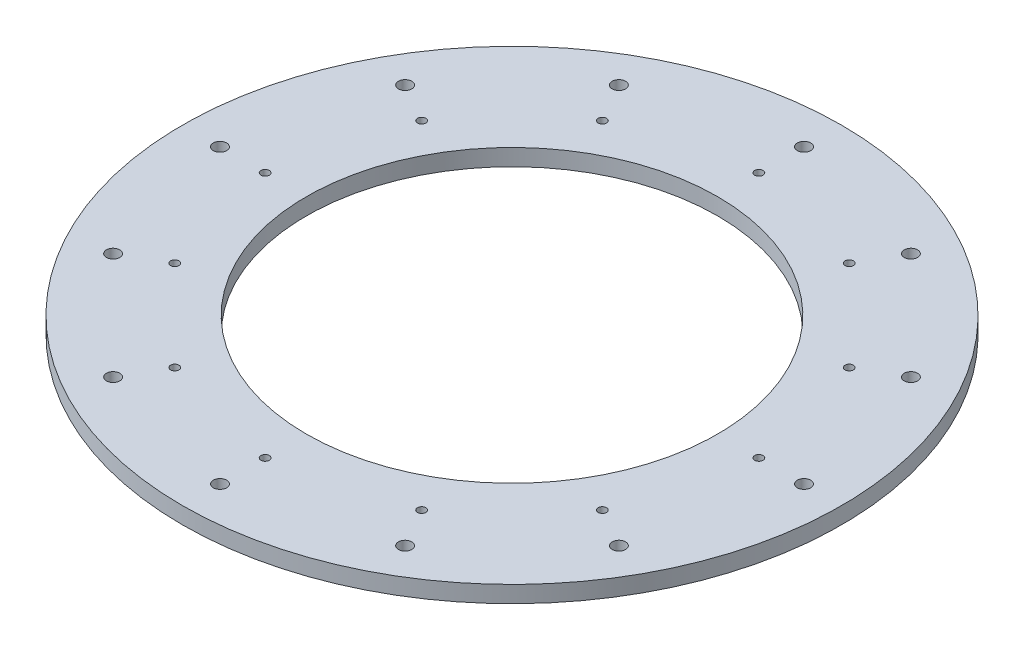
ISO-10303-21;
HEADER;
FILE_DESCRIPTION(('STEP AP214'),'2;1');
FILE_NAME('part.step','',(''),(''),'','','');
FILE_SCHEMA(('AUTOMOTIVE_DESIGN { 1 0 10303 214 1 1 1 1 }'));
ENDSEC;
DATA;
#1=APPLICATION_CONTEXT('core data for automotive mechanical design processes');
#2=APPLICATION_PROTOCOL_DEFINITION('international standard','automotive_design',2000,#1);
#3=PRODUCT_CONTEXT('',#1,'mechanical');
#4=PRODUCT('Part','Part','',(#3));
#5=PRODUCT_RELATED_PRODUCT_CATEGORY('part','',(#4));
#6=PRODUCT_DEFINITION_FORMATION('','',#4);
#7=PRODUCT_DEFINITION_CONTEXT('part definition',#1,'design');
#8=PRODUCT_DEFINITION('design','',#6,#7);
#9=PRODUCT_DEFINITION_SHAPE('','',#8);
#10=(LENGTH_UNIT() NAMED_UNIT(*) SI_UNIT(.MILLI.,.METRE.));
#11=(NAMED_UNIT(*) PLANE_ANGLE_UNIT() SI_UNIT($,.RADIAN.));
#12=(NAMED_UNIT(*) SI_UNIT($,.STERADIAN.) SOLID_ANGLE_UNIT());
#13=UNCERTAINTY_MEASURE_WITH_UNIT(LENGTH_MEASURE(1.E-05),#10,'distance_accuracy_value','');
#14=(GEOMETRIC_REPRESENTATION_CONTEXT(3) GLOBAL_UNCERTAINTY_ASSIGNED_CONTEXT((#13)) GLOBAL_UNIT_ASSIGNED_CONTEXT((#10,
#11,#12)) REPRESENTATION_CONTEXT('',''));
#15=CARTESIAN_POINT('',(0.,0.,0.));
#16=DIRECTION('',(0.,0.,1.));
#17=DIRECTION('',(1.,0.,0.));
#18=AXIS2_PLACEMENT_3D('',#15,#16,#17);
#19=CARTESIAN_POINT('',(0.,4.,0.));
#20=DIRECTION('',(0.,1.,0.));
#21=DIRECTION('',(0.,0.,1.));
#22=AXIS2_PLACEMENT_3D('',#19,#20,#21);
#23=PLANE('',#22);
#24=CARTESIAN_POINT('',(-60.6217782649134,4.,-34.9999999999953));
#25=DIRECTION('',(0.,1.,0.));
#26=DIRECTION('',(0.,0.,1.));
#27=AXIS2_PLACEMENT_3D('',#24,#25,#26);
#28=CIRCLE('',#27,1.6);
#29=CARTESIAN_POINT('',(-60.6217782649134,4.,-33.3999999999953));
#30=VERTEX_POINT('',#29);
#31=EDGE_CURVE('E179',#30,#30,#28,.T.);
#32=ORIENTED_EDGE('',*,*,#31,.F.);
#33=EDGE_LOOP('',(#32));
#34=FACE_BOUND('',#33,.T.);
#35=CARTESIAN_POINT('',(-60.621778264908,4.,35.0000000000047));
#36=DIRECTION('',(0.,1.,0.));
#37=DIRECTION('',(0.,0.,1.));
#38=AXIS2_PLACEMENT_3D('',#35,#36,#37);
#39=CIRCLE('',#38,1.6);
#40=CARTESIAN_POINT('',(-60.621778264908,4.,36.6000000000047));
#41=VERTEX_POINT('',#40);
#42=EDGE_CURVE('E167',#41,#41,#39,.T.);
#43=ORIENTED_EDGE('',*,*,#42,.F.);
#44=EDGE_LOOP('',(#43));
#45=FACE_BOUND('',#44,.T.);
#46=CARTESIAN_POINT('',(5.33826321493611E-12,4.,70.));
#47=DIRECTION('',(0.,1.,0.));
#48=DIRECTION('',(0.,0.,1.));
#49=AXIS2_PLACEMENT_3D('',#46,#47,#48);
#50=CIRCLE('',#49,1.6);
#51=CARTESIAN_POINT('',(5.33826321493611E-12,4.,71.6));
#52=VERTEX_POINT('',#51);
#53=EDGE_CURVE('E155',#52,#52,#50,.T.);
#54=ORIENTED_EDGE('',*,*,#53,.F.);
#55=EDGE_LOOP('',(#54));
#56=FACE_BOUND('',#55,.T.);
#57=CARTESIAN_POINT('',(60.6217782649134,4.,34.9999999999954));
#58=DIRECTION('',(0.,1.,0.));
#59=DIRECTION('',(0.,0.,1.));
#60=AXIS2_PLACEMENT_3D('',#57,#58,#59);
#61=CIRCLE('',#60,1.6);
#62=CARTESIAN_POINT('',(60.6217782649134,4.,36.5999999999954));
#63=VERTEX_POINT('',#62);
#64=EDGE_CURVE('E143',#63,#63,#61,.T.);
#65=ORIENTED_EDGE('',*,*,#64,.F.);
#66=EDGE_LOOP('',(#65));
#67=FACE_BOUND('',#66,.T.);
#68=CARTESIAN_POINT('',(60.621778264908,4.,-35.0000000000046));
#69=DIRECTION('',(0.,1.,0.));
#70=DIRECTION('',(0.,0.,1.));
#71=AXIS2_PLACEMENT_3D('',#68,#69,#70);
#72=CIRCLE('',#71,1.6);
#73=CARTESIAN_POINT('',(60.621778264908,4.,-33.4000000000046));
#74=VERTEX_POINT('',#73);
#75=EDGE_CURVE('E131',#74,#74,#72,.T.);
#76=ORIENTED_EDGE('',*,*,#75,.F.);
#77=EDGE_LOOP('',(#76));
#78=FACE_BOUND('',#77,.T.);
#79=CARTESIAN_POINT('',(-5.33825504828902E-12,4.,-70.));
#80=DIRECTION('',(0.,1.,0.));
#81=DIRECTION('',(0.,0.,1.));
#82=AXIS2_PLACEMENT_3D('',#79,#80,#81);
#83=CIRCLE('',#82,1.6);
#84=CARTESIAN_POINT('',(-5.33825504828902E-12,4.,-68.4));
#85=VERTEX_POINT('',#84);
#86=EDGE_CURVE('E119',#85,#85,#83,.T.);
#87=ORIENTED_EDGE('',*,*,#86,.F.);
#88=EDGE_LOOP('',(#87));
#89=FACE_BOUND('',#88,.T.);
#90=CARTESIAN_POINT('',(-51.2513833959644,4.,-29.5899999999978));
#91=DIRECTION('',(0.,1.,0.));
#92=DIRECTION('',(0.,0.,1.));
#93=AXIS2_PLACEMENT_3D('',#90,#91,#92);
#94=CIRCLE('',#93,0.999999999999998);
#95=CARTESIAN_POINT('',(-51.2513833959644,4.,-28.5899999999978));
#96=VERTEX_POINT('',#95);
#97=EDGE_CURVE('E107',#96,#96,#94,.T.);
#98=ORIENTED_EDGE('',*,*,#97,.F.);
#99=EDGE_LOOP('',(#98));
#100=FACE_BOUND('',#99,.T.);
#101=CARTESIAN_POINT('',(-51.2513833959618,4.,29.5900000000022));
#102=DIRECTION('',(0.,1.,0.));
#103=DIRECTION('',(0.,0.,1.));
#104=AXIS2_PLACEMENT_3D('',#101,#102,#103);
#105=CIRCLE('',#104,0.999999999999998);
#106=CARTESIAN_POINT('',(-51.2513833959618,4.,30.5900000000022));
#107=VERTEX_POINT('',#106);
#108=EDGE_CURVE('E95',#107,#107,#105,.T.);
#109=ORIENTED_EDGE('',*,*,#108,.F.);
#110=EDGE_LOOP('',(#109));
#111=FACE_BOUND('',#110,.T.);
#112=CARTESIAN_POINT('',(2.5155533984381E-12,4.,59.18));
#113=DIRECTION('',(0.,1.,0.));
#114=DIRECTION('',(0.,0.,1.));
#115=AXIS2_PLACEMENT_3D('',#112,#113,#114);
#116=CIRCLE('',#115,1.);
#117=CARTESIAN_POINT('',(2.5155533984381E-12,4.,60.18));
#118=VERTEX_POINT('',#117);
#119=EDGE_CURVE('E83',#118,#118,#116,.T.);
#120=ORIENTED_EDGE('',*,*,#119,.F.);
#121=EDGE_LOOP('',(#120));
#122=FACE_BOUND('',#121,.T.);
#123=CARTESIAN_POINT('',(51.2513833959644,4.,29.5899999999978));
#124=DIRECTION('',(0.,1.,0.));
#125=DIRECTION('',(0.,0.,1.));
#126=AXIS2_PLACEMENT_3D('',#123,#124,#125);
#127=CIRCLE('',#126,0.999999999999998);
#128=CARTESIAN_POINT('',(51.2513833959644,4.,30.5899999999978));
#129=VERTEX_POINT('',#128);
#130=EDGE_CURVE('E71',#129,#129,#127,.T.);
#131=ORIENTED_EDGE('',*,*,#130,.F.);
#132=EDGE_LOOP('',(#131));
#133=FACE_BOUND('',#132,.T.);
#134=CARTESIAN_POINT('',(51.2513833959618,4.,-29.5900000000022));
#135=DIRECTION('',(0.,1.,0.));
#136=DIRECTION('',(0.,0.,1.));
#137=AXIS2_PLACEMENT_3D('',#134,#135,#136);
#138=CIRCLE('',#137,0.999999999999998);
#139=CARTESIAN_POINT('',(51.2513833959618,4.,-28.5900000000022));
#140=VERTEX_POINT('',#139);
#141=EDGE_CURVE('E59',#140,#140,#138,.T.);
#142=ORIENTED_EDGE('',*,*,#141,.F.);
#143=EDGE_LOOP('',(#142));
#144=FACE_BOUND('',#143,.T.);
#145=CARTESIAN_POINT('',(0.,4.,0.));
#146=DIRECTION('',(0.,1.,0.));
#147=DIRECTION('',(0.,0.,1.));
#148=AXIS2_PLACEMENT_3D('',#145,#146,#147);
#149=CIRCLE('',#148,49.3);
#150=CARTESIAN_POINT('',(0.,4.,49.3));
#151=VERTEX_POINT('',#150);
#152=EDGE_CURVE('E47',#151,#151,#149,.T.);
#153=ORIENTED_EDGE('',*,*,#152,.F.);
#154=EDGE_LOOP('',(#153));
#155=FACE_BOUND('',#154,.T.);
#156=CARTESIAN_POINT('',(0.,4.,0.));
#157=DIRECTION('',(0.,1.,0.));
#158=DIRECTION('',(0.,0.,1.));
#159=AXIS2_PLACEMENT_3D('',#156,#157,#158);
#160=CIRCLE('',#159,79.);
#161=CARTESIAN_POINT('',(0.,4.,79.));
#162=VERTEX_POINT('',#161);
#163=EDGE_CURVE('E10',#162,#162,#160,.T.);
#164=ORIENTED_EDGE('',*,*,#163,.T.);
#165=EDGE_LOOP('',(#164));
#166=FACE_BOUND('',#165,.T.);
#167=CARTESIAN_POINT('',(-2.51601204363263E-12,4.,-59.18));
#168=DIRECTION('',(0.,1.,0.));
#169=DIRECTION('',(0.,0.,1.));
#170=AXIS2_PLACEMENT_3D('',#167,#168,#169);
#171=CIRCLE('',#170,1.);
#172=CARTESIAN_POINT('',(-2.51601204363263E-12,4.,-58.18));
#173=VERTEX_POINT('',#172);
#174=EDGE_CURVE('E42',#173,#173,#171,.T.);
#175=ORIENTED_EDGE('',*,*,#174,.F.);
#176=EDGE_LOOP('',(#175));
#177=FACE_BOUND('',#176,.T.);
#178=CARTESIAN_POINT('',(29.5899999999978,4.,-51.2513833959643));
#179=DIRECTION('',(0.,1.,0.));
#180=DIRECTION('',(0.,0.,1.));
#181=AXIS2_PLACEMENT_3D('',#178,#179,#180);
#182=CIRCLE('',#181,1.);
#183=CARTESIAN_POINT('',(29.5899999999978,4.,-50.2513833959643));
#184=VERTEX_POINT('',#183);
#185=EDGE_CURVE('E53',#184,#184,#182,.T.);
#186=ORIENTED_EDGE('',*,*,#185,.F.);
#187=EDGE_LOOP('',(#186));
#188=FACE_BOUND('',#187,.T.);
#189=CARTESIAN_POINT('',(59.18,4.,-2.51881848711832E-12));
#190=DIRECTION('',(0.,1.,0.));
#191=DIRECTION('',(0.,0.,1.));
#192=AXIS2_PLACEMENT_3D('',#189,#190,#191);
#193=CIRCLE('',#192,0.999999999999998);
#194=CARTESIAN_POINT('',(59.18,4.,0.999999999997479));
#195=VERTEX_POINT('',#194);
#196=EDGE_CURVE('E65',#195,#195,#193,.T.);
#197=ORIENTED_EDGE('',*,*,#196,.F.);
#198=EDGE_LOOP('',(#197));
#199=FACE_BOUND('',#198,.T.);
#200=CARTESIAN_POINT('',(29.5900000000022,4.,51.2513833959618));
#201=DIRECTION('',(0.,1.,0.));
#202=DIRECTION('',(0.,0.,1.));
#203=AXIS2_PLACEMENT_3D('',#200,#201,#202);
#204=CIRCLE('',#203,1.);
#205=CARTESIAN_POINT('',(29.5900000000022,4.,52.2513833959618));
#206=VERTEX_POINT('',#205);
#207=EDGE_CURVE('E77',#206,#206,#204,.T.);
#208=ORIENTED_EDGE('',*,*,#207,.F.);
#209=EDGE_LOOP('',(#208));
#210=FACE_BOUND('',#209,.T.);
#211=CARTESIAN_POINT('',(-29.5899999999978,4.,51.2513833959644));
#212=DIRECTION('',(0.,1.,0.));
#213=DIRECTION('',(0.,0.,1.));
#214=AXIS2_PLACEMENT_3D('',#211,#212,#213);
#215=CIRCLE('',#214,1.);
#216=CARTESIAN_POINT('',(-29.5899999999978,4.,52.2513833959644));
#217=VERTEX_POINT('',#216);
#218=EDGE_CURVE('E89',#217,#217,#215,.T.);
#219=ORIENTED_EDGE('',*,*,#218,.F.);
#220=EDGE_LOOP('',(#219));
#221=FACE_BOUND('',#220,.T.);
#222=CARTESIAN_POINT('',(-59.18,4.,2.52575738102223E-12));
#223=DIRECTION('',(0.,1.,0.));
#224=DIRECTION('',(0.,0.,1.));
#225=AXIS2_PLACEMENT_3D('',#222,#223,#224);
#226=CIRCLE('',#225,0.999999999999998);
#227=CARTESIAN_POINT('',(-59.18,4.,1.00000000000252));
#228=VERTEX_POINT('',#227);
#229=EDGE_CURVE('E101',#228,#228,#226,.T.);
#230=ORIENTED_EDGE('',*,*,#229,.F.);
#231=EDGE_LOOP('',(#230));
#232=FACE_BOUND('',#231,.T.);
#233=CARTESIAN_POINT('',(-29.5900000000022,4.,-51.2513833959618));
#234=DIRECTION('',(0.,1.,0.));
#235=DIRECTION('',(0.,0.,1.));
#236=AXIS2_PLACEMENT_3D('',#233,#234,#235);
#237=CIRCLE('',#236,1.);
#238=CARTESIAN_POINT('',(-29.5900000000022,4.,-50.2513833959618));
#239=VERTEX_POINT('',#238);
#240=EDGE_CURVE('E113',#239,#239,#237,.T.);
#241=ORIENTED_EDGE('',*,*,#240,.F.);
#242=EDGE_LOOP('',(#241));
#243=FACE_BOUND('',#242,.T.);
#244=CARTESIAN_POINT('',(34.9999999999954,4.,-60.6217782649134));
#245=DIRECTION('',(0.,1.,0.));
#246=DIRECTION('',(0.,0.,1.));
#247=AXIS2_PLACEMENT_3D('',#244,#245,#246);
#248=CIRCLE('',#247,1.6);
#249=CARTESIAN_POINT('',(34.9999999999954,4.,-59.0217782649134));
#250=VERTEX_POINT('',#249);
#251=EDGE_CURVE('E125',#250,#250,#248,.T.);
#252=ORIENTED_EDGE('',*,*,#251,.F.);
#253=EDGE_LOOP('',(#252));
#254=FACE_BOUND('',#253,.T.);
#255=CARTESIAN_POINT('',(70.,4.,-5.34294830600857E-12));
#256=DIRECTION('',(0.,1.,0.));
#257=DIRECTION('',(0.,0.,1.));
#258=AXIS2_PLACEMENT_3D('',#255,#256,#257);
#259=CIRCLE('',#258,1.60000000000001);
#260=CARTESIAN_POINT('',(70.,4.,1.59999999999466));
#261=VERTEX_POINT('',#260);
#262=EDGE_CURVE('E137',#261,#261,#259,.T.);
#263=ORIENTED_EDGE('',*,*,#262,.F.);
#264=EDGE_LOOP('',(#263));
#265=FACE_BOUND('',#264,.T.);
#266=CARTESIAN_POINT('',(35.0000000000047,4.,60.621778264908));
#267=DIRECTION('',(0.,1.,0.));
#268=DIRECTION('',(0.,0.,1.));
#269=AXIS2_PLACEMENT_3D('',#266,#267,#268);
#270=CIRCLE('',#269,1.6);
#271=CARTESIAN_POINT('',(35.0000000000047,4.,62.221778264908));
#272=VERTEX_POINT('',#271);
#273=EDGE_CURVE('E149',#272,#272,#270,.T.);
#274=ORIENTED_EDGE('',*,*,#273,.F.);
#275=EDGE_LOOP('',(#274));
#276=FACE_BOUND('',#275,.T.);
#277=CARTESIAN_POINT('',(-34.9999999999954,4.,60.6217782649134));
#278=DIRECTION('',(0.,1.,0.));
#279=DIRECTION('',(0.,0.,1.));
#280=AXIS2_PLACEMENT_3D('',#277,#278,#279);
#281=CIRCLE('',#280,1.6);
#282=CARTESIAN_POINT('',(-34.9999999999954,4.,62.2217782649134));
#283=VERTEX_POINT('',#282);
#284=EDGE_CURVE('E161',#283,#283,#281,.T.);
#285=ORIENTED_EDGE('',*,*,#284,.F.);
#286=EDGE_LOOP('',(#285));
#287=FACE_BOUND('',#286,.T.);
#288=CARTESIAN_POINT('',(-70.,4.,5.35075456165046E-12));
#289=DIRECTION('',(0.,1.,0.));
#290=DIRECTION('',(0.,0.,1.));
#291=AXIS2_PLACEMENT_3D('',#288,#289,#290);
#292=CIRCLE('',#291,1.60000000000001);
#293=CARTESIAN_POINT('',(-70.,4.,1.60000000000536));
#294=VERTEX_POINT('',#293);
#295=EDGE_CURVE('E173',#294,#294,#292,.T.);
#296=ORIENTED_EDGE('',*,*,#295,.F.);
#297=EDGE_LOOP('',(#296));
#298=FACE_BOUND('',#297,.T.);
#299=CARTESIAN_POINT('',(-35.0000000000047,4.,-60.621778264908));
#300=DIRECTION('',(0.,1.,0.));
#301=DIRECTION('',(0.,0.,1.));
#302=AXIS2_PLACEMENT_3D('',#299,#300,#301);
#303=CIRCLE('',#302,1.6);
#304=CARTESIAN_POINT('',(-35.0000000000047,4.,-59.021778264908));
#305=VERTEX_POINT('',#304);
#306=EDGE_CURVE('E185',#305,#305,#303,.T.);
#307=ORIENTED_EDGE('',*,*,#306,.F.);
#308=EDGE_LOOP('',(#307));
#309=FACE_BOUND('',#308,.T.);
#310=ADVANCED_FACE('F31',(#34,#45,#56,#67,#78,#89,#100,#111,#122,#133,#144,#155,#166,#177,#188,
#199,#210,#221,#232,#243,#254,#265,#276,#287,#298,#309),#23,.T.);
#311=CARTESIAN_POINT('',(0.,0.,0.));
#312=DIRECTION('',(0.,1.,0.));
#313=DIRECTION('',(0.,0.,1.));
#314=AXIS2_PLACEMENT_3D('',#311,#312,#313);
#315=PLANE('',#314);
#316=CARTESIAN_POINT('',(0.,0.,0.));
#317=DIRECTION('',(0.,1.,0.));
#318=DIRECTION('',(0.,0.,1.));
#319=AXIS2_PLACEMENT_3D('',#316,#317,#318);
#320=CIRCLE('',#319,79.);
#321=CARTESIAN_POINT('',(0.,0.,79.));
#322=VERTEX_POINT('',#321);
#323=EDGE_CURVE('E35',#322,#322,#320,.T.);
#324=ORIENTED_EDGE('',*,*,#323,.F.);
#325=EDGE_LOOP('',(#324));
#326=FACE_BOUND('',#325,.T.);
#327=CARTESIAN_POINT('',(-2.51601204363263E-12,0.,-59.18));
#328=DIRECTION('',(0.,1.,0.));
#329=DIRECTION('',(0.,0.,1.));
#330=AXIS2_PLACEMENT_3D('',#327,#328,#329);
#331=CIRCLE('',#330,1.);
#332=CARTESIAN_POINT('',(-2.51601204363263E-12,0.,-58.18));
#333=VERTEX_POINT('',#332);
#334=EDGE_CURVE('E44',#333,#333,#331,.T.);
#335=ORIENTED_EDGE('',*,*,#334,.T.);
#336=EDGE_LOOP('',(#335));
#337=FACE_BOUND('',#336,.T.);
#338=CARTESIAN_POINT('',(0.,0.,0.));
#339=DIRECTION('',(0.,1.,0.));
#340=DIRECTION('',(0.,0.,1.));
#341=AXIS2_PLACEMENT_3D('',#338,#339,#340);
#342=CIRCLE('',#341,49.3);
#343=CARTESIAN_POINT('',(0.,0.,49.3));
#344=VERTEX_POINT('',#343);
#345=EDGE_CURVE('E50',#344,#344,#342,.T.);
#346=ORIENTED_EDGE('',*,*,#345,.T.);
#347=EDGE_LOOP('',(#346));
#348=FACE_BOUND('',#347,.T.);
#349=CARTESIAN_POINT('',(29.5899999999978,0.,-51.2513833959643));
#350=DIRECTION('',(0.,1.,0.));
#351=DIRECTION('',(0.,0.,1.));
#352=AXIS2_PLACEMENT_3D('',#349,#350,#351);
#353=CIRCLE('',#352,1.);
#354=CARTESIAN_POINT('',(29.5899999999978,0.,-50.2513833959643));
#355=VERTEX_POINT('',#354);
#356=EDGE_CURVE('E56',#355,#355,#353,.T.);
#357=ORIENTED_EDGE('',*,*,#356,.T.);
#358=EDGE_LOOP('',(#357));
#359=FACE_BOUND('',#358,.T.);
#360=CARTESIAN_POINT('',(51.2513833959618,0.,-29.5900000000022));
#361=DIRECTION('',(0.,1.,0.));
#362=DIRECTION('',(0.,0.,1.));
#363=AXIS2_PLACEMENT_3D('',#360,#361,#362);
#364=CIRCLE('',#363,0.999999999999998);
#365=CARTESIAN_POINT('',(51.2513833959618,0.,-28.5900000000022));
#366=VERTEX_POINT('',#365);
#367=EDGE_CURVE('E62',#366,#366,#364,.T.);
#368=ORIENTED_EDGE('',*,*,#367,.T.);
#369=EDGE_LOOP('',(#368));
#370=FACE_BOUND('',#369,.T.);
#371=CARTESIAN_POINT('',(59.18,0.,-2.51881848711832E-12));
#372=DIRECTION('',(0.,1.,0.));
#373=DIRECTION('',(0.,0.,1.));
#374=AXIS2_PLACEMENT_3D('',#371,#372,#373);
#375=CIRCLE('',#374,0.999999999999998);
#376=CARTESIAN_POINT('',(59.18,0.,0.999999999997479));
#377=VERTEX_POINT('',#376);
#378=EDGE_CURVE('E68',#377,#377,#375,.T.);
#379=ORIENTED_EDGE('',*,*,#378,.T.);
#380=EDGE_LOOP('',(#379));
#381=FACE_BOUND('',#380,.T.);
#382=CARTESIAN_POINT('',(51.2513833959644,0.,29.5899999999978));
#383=DIRECTION('',(0.,1.,0.));
#384=DIRECTION('',(0.,0.,1.));
#385=AXIS2_PLACEMENT_3D('',#382,#383,#384);
#386=CIRCLE('',#385,0.999999999999998);
#387=CARTESIAN_POINT('',(51.2513833959644,0.,30.5899999999978));
#388=VERTEX_POINT('',#387);
#389=EDGE_CURVE('E74',#388,#388,#386,.T.);
#390=ORIENTED_EDGE('',*,*,#389,.T.);
#391=EDGE_LOOP('',(#390));
#392=FACE_BOUND('',#391,.T.);
#393=CARTESIAN_POINT('',(29.5900000000022,0.,51.2513833959618));
#394=DIRECTION('',(0.,1.,0.));
#395=DIRECTION('',(0.,0.,1.));
#396=AXIS2_PLACEMENT_3D('',#393,#394,#395);
#397=CIRCLE('',#396,1.);
#398=CARTESIAN_POINT('',(29.5900000000022,0.,52.2513833959618));
#399=VERTEX_POINT('',#398);
#400=EDGE_CURVE('E80',#399,#399,#397,.T.);
#401=ORIENTED_EDGE('',*,*,#400,.T.);
#402=EDGE_LOOP('',(#401));
#403=FACE_BOUND('',#402,.T.);
#404=CARTESIAN_POINT('',(2.5155533984381E-12,0.,59.18));
#405=DIRECTION('',(0.,1.,0.));
#406=DIRECTION('',(0.,0.,1.));
#407=AXIS2_PLACEMENT_3D('',#404,#405,#406);
#408=CIRCLE('',#407,1.);
#409=CARTESIAN_POINT('',(2.5155533984381E-12,0.,60.18));
#410=VERTEX_POINT('',#409);
#411=EDGE_CURVE('E86',#410,#410,#408,.T.);
#412=ORIENTED_EDGE('',*,*,#411,.T.);
#413=EDGE_LOOP('',(#412));
#414=FACE_BOUND('',#413,.T.);
#415=CARTESIAN_POINT('',(-29.5899999999978,0.,51.2513833959644));
#416=DIRECTION('',(0.,1.,0.));
#417=DIRECTION('',(0.,0.,1.));
#418=AXIS2_PLACEMENT_3D('',#415,#416,#417);
#419=CIRCLE('',#418,1.);
#420=CARTESIAN_POINT('',(-29.5899999999978,0.,52.2513833959644));
#421=VERTEX_POINT('',#420);
#422=EDGE_CURVE('E92',#421,#421,#419,.T.);
#423=ORIENTED_EDGE('',*,*,#422,.T.);
#424=EDGE_LOOP('',(#423));
#425=FACE_BOUND('',#424,.T.);
#426=CARTESIAN_POINT('',(-51.2513833959618,0.,29.5900000000022));
#427=DIRECTION('',(0.,1.,0.));
#428=DIRECTION('',(0.,0.,1.));
#429=AXIS2_PLACEMENT_3D('',#426,#427,#428);
#430=CIRCLE('',#429,0.999999999999998);
#431=CARTESIAN_POINT('',(-51.2513833959618,0.,30.5900000000022));
#432=VERTEX_POINT('',#431);
#433=EDGE_CURVE('E98',#432,#432,#430,.T.);
#434=ORIENTED_EDGE('',*,*,#433,.T.);
#435=EDGE_LOOP('',(#434));
#436=FACE_BOUND('',#435,.T.);
#437=CARTESIAN_POINT('',(-59.18,0.,2.52575738102223E-12));
#438=DIRECTION('',(0.,1.,0.));
#439=DIRECTION('',(0.,0.,1.));
#440=AXIS2_PLACEMENT_3D('',#437,#438,#439);
#441=CIRCLE('',#440,0.999999999999998);
#442=CARTESIAN_POINT('',(-59.18,0.,1.00000000000252));
#443=VERTEX_POINT('',#442);
#444=EDGE_CURVE('E104',#443,#443,#441,.T.);
#445=ORIENTED_EDGE('',*,*,#444,.T.);
#446=EDGE_LOOP('',(#445));
#447=FACE_BOUND('',#446,.T.);
#448=CARTESIAN_POINT('',(-51.2513833959644,0.,-29.5899999999978));
#449=DIRECTION('',(0.,1.,0.));
#450=DIRECTION('',(0.,0.,1.));
#451=AXIS2_PLACEMENT_3D('',#448,#449,#450);
#452=CIRCLE('',#451,0.999999999999998);
#453=CARTESIAN_POINT('',(-51.2513833959644,0.,-28.5899999999978));
#454=VERTEX_POINT('',#453);
#455=EDGE_CURVE('E110',#454,#454,#452,.T.);
#456=ORIENTED_EDGE('',*,*,#455,.T.);
#457=EDGE_LOOP('',(#456));
#458=FACE_BOUND('',#457,.T.);
#459=CARTESIAN_POINT('',(-29.5900000000022,0.,-51.2513833959618));
#460=DIRECTION('',(0.,1.,0.));
#461=DIRECTION('',(0.,0.,1.));
#462=AXIS2_PLACEMENT_3D('',#459,#460,#461);
#463=CIRCLE('',#462,1.);
#464=CARTESIAN_POINT('',(-29.5900000000022,0.,-50.2513833959618));
#465=VERTEX_POINT('',#464);
#466=EDGE_CURVE('E116',#465,#465,#463,.T.);
#467=ORIENTED_EDGE('',*,*,#466,.T.);
#468=EDGE_LOOP('',(#467));
#469=FACE_BOUND('',#468,.T.);
#470=CARTESIAN_POINT('',(-5.33825504828902E-12,0.,-70.));
#471=DIRECTION('',(0.,1.,0.));
#472=DIRECTION('',(0.,0.,1.));
#473=AXIS2_PLACEMENT_3D('',#470,#471,#472);
#474=CIRCLE('',#473,1.6);
#475=CARTESIAN_POINT('',(-5.33825504828902E-12,0.,-68.4));
#476=VERTEX_POINT('',#475);
#477=EDGE_CURVE('E122',#476,#476,#474,.T.);
#478=ORIENTED_EDGE('',*,*,#477,.T.);
#479=EDGE_LOOP('',(#478));
#480=FACE_BOUND('',#479,.T.);
#481=CARTESIAN_POINT('',(34.9999999999954,0.,-60.6217782649134));
#482=DIRECTION('',(0.,1.,0.));
#483=DIRECTION('',(0.,0.,1.));
#484=AXIS2_PLACEMENT_3D('',#481,#482,#483);
#485=CIRCLE('',#484,1.6);
#486=CARTESIAN_POINT('',(34.9999999999954,0.,-59.0217782649134));
#487=VERTEX_POINT('',#486);
#488=EDGE_CURVE('E128',#487,#487,#485,.T.);
#489=ORIENTED_EDGE('',*,*,#488,.T.);
#490=EDGE_LOOP('',(#489));
#491=FACE_BOUND('',#490,.T.);
#492=CARTESIAN_POINT('',(60.621778264908,0.,-35.0000000000046));
#493=DIRECTION('',(0.,1.,0.));
#494=DIRECTION('',(0.,0.,1.));
#495=AXIS2_PLACEMENT_3D('',#492,#493,#494);
#496=CIRCLE('',#495,1.6);
#497=CARTESIAN_POINT('',(60.621778264908,0.,-33.4000000000046));
#498=VERTEX_POINT('',#497);
#499=EDGE_CURVE('E134',#498,#498,#496,.T.);
#500=ORIENTED_EDGE('',*,*,#499,.T.);
#501=EDGE_LOOP('',(#500));
#502=FACE_BOUND('',#501,.T.);
#503=CARTESIAN_POINT('',(70.,0.,-5.34294830600857E-12));
#504=DIRECTION('',(0.,1.,0.));
#505=DIRECTION('',(0.,0.,1.));
#506=AXIS2_PLACEMENT_3D('',#503,#504,#505);
#507=CIRCLE('',#506,1.60000000000001);
#508=CARTESIAN_POINT('',(70.,0.,1.59999999999466));
#509=VERTEX_POINT('',#508);
#510=EDGE_CURVE('E140',#509,#509,#507,.T.);
#511=ORIENTED_EDGE('',*,*,#510,.T.);
#512=EDGE_LOOP('',(#511));
#513=FACE_BOUND('',#512,.T.);
#514=CARTESIAN_POINT('',(60.6217782649134,0.,34.9999999999954));
#515=DIRECTION('',(0.,1.,0.));
#516=DIRECTION('',(0.,0.,1.));
#517=AXIS2_PLACEMENT_3D('',#514,#515,#516);
#518=CIRCLE('',#517,1.6);
#519=CARTESIAN_POINT('',(60.6217782649134,0.,36.5999999999954));
#520=VERTEX_POINT('',#519);
#521=EDGE_CURVE('E146',#520,#520,#518,.T.);
#522=ORIENTED_EDGE('',*,*,#521,.T.);
#523=EDGE_LOOP('',(#522));
#524=FACE_BOUND('',#523,.T.);
#525=CARTESIAN_POINT('',(35.0000000000047,0.,60.621778264908));
#526=DIRECTION('',(0.,1.,0.));
#527=DIRECTION('',(0.,0.,1.));
#528=AXIS2_PLACEMENT_3D('',#525,#526,#527);
#529=CIRCLE('',#528,1.6);
#530=CARTESIAN_POINT('',(35.0000000000047,0.,62.221778264908));
#531=VERTEX_POINT('',#530);
#532=EDGE_CURVE('E152',#531,#531,#529,.T.);
#533=ORIENTED_EDGE('',*,*,#532,.T.);
#534=EDGE_LOOP('',(#533));
#535=FACE_BOUND('',#534,.T.);
#536=CARTESIAN_POINT('',(5.33826321493611E-12,0.,70.));
#537=DIRECTION('',(0.,1.,0.));
#538=DIRECTION('',(0.,0.,1.));
#539=AXIS2_PLACEMENT_3D('',#536,#537,#538);
#540=CIRCLE('',#539,1.6);
#541=CARTESIAN_POINT('',(5.33826321493611E-12,0.,71.6));
#542=VERTEX_POINT('',#541);
#543=EDGE_CURVE('E158',#542,#542,#540,.T.);
#544=ORIENTED_EDGE('',*,*,#543,.T.);
#545=EDGE_LOOP('',(#544));
#546=FACE_BOUND('',#545,.T.);
#547=CARTESIAN_POINT('',(-34.9999999999954,0.,60.6217782649134));
#548=DIRECTION('',(0.,1.,0.));
#549=DIRECTION('',(0.,0.,1.));
#550=AXIS2_PLACEMENT_3D('',#547,#548,#549);
#551=CIRCLE('',#550,1.6);
#552=CARTESIAN_POINT('',(-34.9999999999954,0.,62.2217782649134));
#553=VERTEX_POINT('',#552);
#554=EDGE_CURVE('E164',#553,#553,#551,.T.);
#555=ORIENTED_EDGE('',*,*,#554,.T.);
#556=EDGE_LOOP('',(#555));
#557=FACE_BOUND('',#556,.T.);
#558=CARTESIAN_POINT('',(-60.621778264908,0.,35.0000000000047));
#559=DIRECTION('',(0.,1.,0.));
#560=DIRECTION('',(0.,0.,1.));
#561=AXIS2_PLACEMENT_3D('',#558,#559,#560);
#562=CIRCLE('',#561,1.6);
#563=CARTESIAN_POINT('',(-60.621778264908,0.,36.6000000000047));
#564=VERTEX_POINT('',#563);
#565=EDGE_CURVE('E170',#564,#564,#562,.T.);
#566=ORIENTED_EDGE('',*,*,#565,.T.);
#567=EDGE_LOOP('',(#566));
#568=FACE_BOUND('',#567,.T.);
#569=CARTESIAN_POINT('',(-70.,0.,5.35075456165046E-12));
#570=DIRECTION('',(0.,1.,0.));
#571=DIRECTION('',(0.,0.,1.));
#572=AXIS2_PLACEMENT_3D('',#569,#570,#571);
#573=CIRCLE('',#572,1.60000000000001);
#574=CARTESIAN_POINT('',(-70.,0.,1.60000000000536));
#575=VERTEX_POINT('',#574);
#576=EDGE_CURVE('E176',#575,#575,#573,.T.);
#577=ORIENTED_EDGE('',*,*,#576,.T.);
#578=EDGE_LOOP('',(#577));
#579=FACE_BOUND('',#578,.T.);
#580=CARTESIAN_POINT('',(-60.6217782649134,0.,-34.9999999999953));
#581=DIRECTION('',(0.,1.,0.));
#582=DIRECTION('',(0.,0.,1.));
#583=AXIS2_PLACEMENT_3D('',#580,#581,#582);
#584=CIRCLE('',#583,1.6);
#585=CARTESIAN_POINT('',(-60.6217782649134,0.,-33.3999999999953));
#586=VERTEX_POINT('',#585);
#587=EDGE_CURVE('E182',#586,#586,#584,.T.);
#588=ORIENTED_EDGE('',*,*,#587,.T.);
#589=EDGE_LOOP('',(#588));
#590=FACE_BOUND('',#589,.T.);
#591=CARTESIAN_POINT('',(-35.0000000000047,0.,-60.621778264908));
#592=DIRECTION('',(0.,1.,0.));
#593=DIRECTION('',(0.,0.,1.));
#594=AXIS2_PLACEMENT_3D('',#591,#592,#593);
#595=CIRCLE('',#594,1.6);
#596=CARTESIAN_POINT('',(-35.0000000000047,0.,-59.021778264908));
#597=VERTEX_POINT('',#596);
#598=EDGE_CURVE('E188',#597,#597,#595,.T.);
#599=ORIENTED_EDGE('',*,*,#598,.T.);
#600=EDGE_LOOP('',(#599));
#601=FACE_BOUND('',#600,.T.);
#602=ADVANCED_FACE('F198',(#326,#337,#348,#359,#370,#381,#392,#403,#414,#425,#436,#447,#458,
#469,#480,#491,#502,#513,#524,#535,#546,#557,#568,#579,#590,#601),#315,.F.);
#603=CARTESIAN_POINT('',(0.,4.,0.));
#604=DIRECTION('',(0.,-1.,0.));
#605=DIRECTION('',(0.,0.,-1.));
#606=AXIS2_PLACEMENT_3D('',#603,#604,#605);
#607=CYLINDRICAL_SURFACE('',#606,79.);
#608=ORIENTED_EDGE('',*,*,#163,.F.);
#609=EDGE_LOOP('',(#608));
#610=FACE_BOUND('',#609,.T.);
#611=ORIENTED_EDGE('',*,*,#323,.T.);
#612=EDGE_LOOP('',(#611));
#613=FACE_BOUND('',#612,.T.);
#614=ADVANCED_FACE('F33',(#610,#613),#607,.T.);
#615=CARTESIAN_POINT('',(-2.51601204363263E-12,4.,-59.18));
#616=DIRECTION('',(0.,-1.,0.));
#617=DIRECTION('',(0.,0.,-1.));
#618=AXIS2_PLACEMENT_3D('',#615,#616,#617);
#619=CYLINDRICAL_SURFACE('',#618,1.);
#620=ORIENTED_EDGE('',*,*,#174,.T.);
#621=EDGE_LOOP('',(#620));
#622=FACE_BOUND('',#621,.T.);
#623=ORIENTED_EDGE('',*,*,#334,.F.);
#624=EDGE_LOOP('',(#623));
#625=FACE_BOUND('',#624,.T.);
#626=ADVANCED_FACE('F208',(#622,#625),#619,.F.);
#627=CARTESIAN_POINT('',(0.,4.,0.));
#628=DIRECTION('',(0.,-1.,0.));
#629=DIRECTION('',(0.,0.,-1.));
#630=AXIS2_PLACEMENT_3D('',#627,#628,#629);
#631=CYLINDRICAL_SURFACE('',#630,49.3);
#632=ORIENTED_EDGE('',*,*,#152,.T.);
#633=EDGE_LOOP('',(#632));
#634=FACE_BOUND('',#633,.T.);
#635=ORIENTED_EDGE('',*,*,#345,.F.);
#636=EDGE_LOOP('',(#635));
#637=FACE_BOUND('',#636,.T.);
#638=ADVANCED_FACE('F211',(#634,#637),#631,.F.);
#639=CARTESIAN_POINT('',(29.5899999999978,4.,-51.2513833959643));
#640=DIRECTION('',(0.,-1.,0.));
#641=DIRECTION('',(0.,0.,-1.));
#642=AXIS2_PLACEMENT_3D('',#639,#640,#641);
#643=CYLINDRICAL_SURFACE('',#642,1.);
#644=ORIENTED_EDGE('',*,*,#185,.T.);
#645=EDGE_LOOP('',(#644));
#646=FACE_BOUND('',#645,.T.);
#647=ORIENTED_EDGE('',*,*,#356,.F.);
#648=EDGE_LOOP('',(#647));
#649=FACE_BOUND('',#648,.T.);
#650=ADVANCED_FACE('F215',(#646,#649),#643,.F.);
#651=CARTESIAN_POINT('',(51.2513833959618,4.,-29.5900000000022));
#652=DIRECTION('',(0.,-1.,0.));
#653=DIRECTION('',(0.,0.,-1.));
#654=AXIS2_PLACEMENT_3D('',#651,#652,#653);
#655=CYLINDRICAL_SURFACE('',#654,0.999999999999998);
#656=ORIENTED_EDGE('',*,*,#141,.T.);
#657=EDGE_LOOP('',(#656));
#658=FACE_BOUND('',#657,.T.);
#659=ORIENTED_EDGE('',*,*,#367,.F.);
#660=EDGE_LOOP('',(#659));
#661=FACE_BOUND('',#660,.T.);
#662=ADVANCED_FACE('F219',(#658,#661),#655,.F.);
#663=CARTESIAN_POINT('',(59.18,4.,-2.51881848711832E-12));
#664=DIRECTION('',(0.,-1.,0.));
#665=DIRECTION('',(0.,0.,-1.));
#666=AXIS2_PLACEMENT_3D('',#663,#664,#665);
#667=CYLINDRICAL_SURFACE('',#666,0.999999999999998);
#668=ORIENTED_EDGE('',*,*,#196,.T.);
#669=EDGE_LOOP('',(#668));
#670=FACE_BOUND('',#669,.T.);
#671=ORIENTED_EDGE('',*,*,#378,.F.);
#672=EDGE_LOOP('',(#671));
#673=FACE_BOUND('',#672,.T.);
#674=ADVANCED_FACE('F223',(#670,#673),#667,.F.);
#675=CARTESIAN_POINT('',(51.2513833959644,4.,29.5899999999978));
#676=DIRECTION('',(0.,-1.,0.));
#677=DIRECTION('',(0.,0.,-1.));
#678=AXIS2_PLACEMENT_3D('',#675,#676,#677);
#679=CYLINDRICAL_SURFACE('',#678,0.999999999999998);
#680=ORIENTED_EDGE('',*,*,#130,.T.);
#681=EDGE_LOOP('',(#680));
#682=FACE_BOUND('',#681,.T.);
#683=ORIENTED_EDGE('',*,*,#389,.F.);
#684=EDGE_LOOP('',(#683));
#685=FACE_BOUND('',#684,.T.);
#686=ADVANCED_FACE('F227',(#682,#685),#679,.F.);
#687=CARTESIAN_POINT('',(29.5900000000022,4.,51.2513833959618));
#688=DIRECTION('',(0.,-1.,0.));
#689=DIRECTION('',(0.,0.,-1.));
#690=AXIS2_PLACEMENT_3D('',#687,#688,#689);
#691=CYLINDRICAL_SURFACE('',#690,1.);
#692=ORIENTED_EDGE('',*,*,#207,.T.);
#693=EDGE_LOOP('',(#692));
#694=FACE_BOUND('',#693,.T.);
#695=ORIENTED_EDGE('',*,*,#400,.F.);
#696=EDGE_LOOP('',(#695));
#697=FACE_BOUND('',#696,.T.);
#698=ADVANCED_FACE('F231',(#694,#697),#691,.F.);
#699=CARTESIAN_POINT('',(2.5155533984381E-12,4.,59.18));
#700=DIRECTION('',(0.,-1.,0.));
#701=DIRECTION('',(0.,0.,-1.));
#702=AXIS2_PLACEMENT_3D('',#699,#700,#701);
#703=CYLINDRICAL_SURFACE('',#702,1.);
#704=ORIENTED_EDGE('',*,*,#119,.T.);
#705=EDGE_LOOP('',(#704));
#706=FACE_BOUND('',#705,.T.);
#707=ORIENTED_EDGE('',*,*,#411,.F.);
#708=EDGE_LOOP('',(#707));
#709=FACE_BOUND('',#708,.T.);
#710=ADVANCED_FACE('F235',(#706,#709),#703,.F.);
#711=CARTESIAN_POINT('',(-29.5899999999978,4.,51.2513833959644));
#712=DIRECTION('',(0.,-1.,0.));
#713=DIRECTION('',(0.,0.,-1.));
#714=AXIS2_PLACEMENT_3D('',#711,#712,#713);
#715=CYLINDRICAL_SURFACE('',#714,1.);
#716=ORIENTED_EDGE('',*,*,#218,.T.);
#717=EDGE_LOOP('',(#716));
#718=FACE_BOUND('',#717,.T.);
#719=ORIENTED_EDGE('',*,*,#422,.F.);
#720=EDGE_LOOP('',(#719));
#721=FACE_BOUND('',#720,.T.);
#722=ADVANCED_FACE('F239',(#718,#721),#715,.F.);
#723=CARTESIAN_POINT('',(-51.2513833959618,4.,29.5900000000022));
#724=DIRECTION('',(0.,-1.,0.));
#725=DIRECTION('',(0.,0.,-1.));
#726=AXIS2_PLACEMENT_3D('',#723,#724,#725);
#727=CYLINDRICAL_SURFACE('',#726,0.999999999999998);
#728=ORIENTED_EDGE('',*,*,#108,.T.);
#729=EDGE_LOOP('',(#728));
#730=FACE_BOUND('',#729,.T.);
#731=ORIENTED_EDGE('',*,*,#433,.F.);
#732=EDGE_LOOP('',(#731));
#733=FACE_BOUND('',#732,.T.);
#734=ADVANCED_FACE('F243',(#730,#733),#727,.F.);
#735=CARTESIAN_POINT('',(-59.18,4.,2.52575738102223E-12));
#736=DIRECTION('',(0.,-1.,0.));
#737=DIRECTION('',(0.,0.,-1.));
#738=AXIS2_PLACEMENT_3D('',#735,#736,#737);
#739=CYLINDRICAL_SURFACE('',#738,0.999999999999998);
#740=ORIENTED_EDGE('',*,*,#229,.T.);
#741=EDGE_LOOP('',(#740));
#742=FACE_BOUND('',#741,.T.);
#743=ORIENTED_EDGE('',*,*,#444,.F.);
#744=EDGE_LOOP('',(#743));
#745=FACE_BOUND('',#744,.T.);
#746=ADVANCED_FACE('F247',(#742,#745),#739,.F.);
#747=CARTESIAN_POINT('',(-51.2513833959644,4.,-29.5899999999978));
#748=DIRECTION('',(0.,-1.,0.));
#749=DIRECTION('',(0.,0.,-1.));
#750=AXIS2_PLACEMENT_3D('',#747,#748,#749);
#751=CYLINDRICAL_SURFACE('',#750,0.999999999999998);
#752=ORIENTED_EDGE('',*,*,#97,.T.);
#753=EDGE_LOOP('',(#752));
#754=FACE_BOUND('',#753,.T.);
#755=ORIENTED_EDGE('',*,*,#455,.F.);
#756=EDGE_LOOP('',(#755));
#757=FACE_BOUND('',#756,.T.);
#758=ADVANCED_FACE('F251',(#754,#757),#751,.F.);
#759=CARTESIAN_POINT('',(-29.5900000000022,4.,-51.2513833959618));
#760=DIRECTION('',(0.,-1.,0.));
#761=DIRECTION('',(0.,0.,-1.));
#762=AXIS2_PLACEMENT_3D('',#759,#760,#761);
#763=CYLINDRICAL_SURFACE('',#762,1.);
#764=ORIENTED_EDGE('',*,*,#240,.T.);
#765=EDGE_LOOP('',(#764));
#766=FACE_BOUND('',#765,.T.);
#767=ORIENTED_EDGE('',*,*,#466,.F.);
#768=EDGE_LOOP('',(#767));
#769=FACE_BOUND('',#768,.T.);
#770=ADVANCED_FACE('F255',(#766,#769),#763,.F.);
#771=CARTESIAN_POINT('',(-5.33825504828902E-12,4.,-70.));
#772=DIRECTION('',(0.,-1.,0.));
#773=DIRECTION('',(0.,0.,-1.));
#774=AXIS2_PLACEMENT_3D('',#771,#772,#773);
#775=CYLINDRICAL_SURFACE('',#774,1.6);
#776=ORIENTED_EDGE('',*,*,#86,.T.);
#777=EDGE_LOOP('',(#776));
#778=FACE_BOUND('',#777,.T.);
#779=ORIENTED_EDGE('',*,*,#477,.F.);
#780=EDGE_LOOP('',(#779));
#781=FACE_BOUND('',#780,.T.);
#782=ADVANCED_FACE('F259',(#778,#781),#775,.F.);
#783=CARTESIAN_POINT('',(34.9999999999954,4.,-60.6217782649134));
#784=DIRECTION('',(0.,-1.,0.));
#785=DIRECTION('',(0.,0.,-1.));
#786=AXIS2_PLACEMENT_3D('',#783,#784,#785);
#787=CYLINDRICAL_SURFACE('',#786,1.6);
#788=ORIENTED_EDGE('',*,*,#251,.T.);
#789=EDGE_LOOP('',(#788));
#790=FACE_BOUND('',#789,.T.);
#791=ORIENTED_EDGE('',*,*,#488,.F.);
#792=EDGE_LOOP('',(#791));
#793=FACE_BOUND('',#792,.T.);
#794=ADVANCED_FACE('F263',(#790,#793),#787,.F.);
#795=CARTESIAN_POINT('',(60.621778264908,4.,-35.0000000000046));
#796=DIRECTION('',(0.,-1.,0.));
#797=DIRECTION('',(0.,0.,-1.));
#798=AXIS2_PLACEMENT_3D('',#795,#796,#797);
#799=CYLINDRICAL_SURFACE('',#798,1.6);
#800=ORIENTED_EDGE('',*,*,#75,.T.);
#801=EDGE_LOOP('',(#800));
#802=FACE_BOUND('',#801,.T.);
#803=ORIENTED_EDGE('',*,*,#499,.F.);
#804=EDGE_LOOP('',(#803));
#805=FACE_BOUND('',#804,.T.);
#806=ADVANCED_FACE('F267',(#802,#805),#799,.F.);
#807=CARTESIAN_POINT('',(70.,4.,-5.34294830600857E-12));
#808=DIRECTION('',(0.,-1.,0.));
#809=DIRECTION('',(0.,0.,-1.));
#810=AXIS2_PLACEMENT_3D('',#807,#808,#809);
#811=CYLINDRICAL_SURFACE('',#810,1.60000000000001);
#812=ORIENTED_EDGE('',*,*,#262,.T.);
#813=EDGE_LOOP('',(#812));
#814=FACE_BOUND('',#813,.T.);
#815=ORIENTED_EDGE('',*,*,#510,.F.);
#816=EDGE_LOOP('',(#815));
#817=FACE_BOUND('',#816,.T.);
#818=ADVANCED_FACE('F271',(#814,#817),#811,.F.);
#819=CARTESIAN_POINT('',(60.6217782649134,4.,34.9999999999954));
#820=DIRECTION('',(0.,-1.,0.));
#821=DIRECTION('',(0.,0.,-1.));
#822=AXIS2_PLACEMENT_3D('',#819,#820,#821);
#823=CYLINDRICAL_SURFACE('',#822,1.6);
#824=ORIENTED_EDGE('',*,*,#64,.T.);
#825=EDGE_LOOP('',(#824));
#826=FACE_BOUND('',#825,.T.);
#827=ORIENTED_EDGE('',*,*,#521,.F.);
#828=EDGE_LOOP('',(#827));
#829=FACE_BOUND('',#828,.T.);
#830=ADVANCED_FACE('F275',(#826,#829),#823,.F.);
#831=CARTESIAN_POINT('',(35.0000000000047,4.,60.621778264908));
#832=DIRECTION('',(0.,-1.,0.));
#833=DIRECTION('',(0.,0.,-1.));
#834=AXIS2_PLACEMENT_3D('',#831,#832,#833);
#835=CYLINDRICAL_SURFACE('',#834,1.6);
#836=ORIENTED_EDGE('',*,*,#273,.T.);
#837=EDGE_LOOP('',(#836));
#838=FACE_BOUND('',#837,.T.);
#839=ORIENTED_EDGE('',*,*,#532,.F.);
#840=EDGE_LOOP('',(#839));
#841=FACE_BOUND('',#840,.T.);
#842=ADVANCED_FACE('F279',(#838,#841),#835,.F.);
#843=CARTESIAN_POINT('',(5.33826321493611E-12,4.,70.));
#844=DIRECTION('',(0.,-1.,0.));
#845=DIRECTION('',(0.,0.,-1.));
#846=AXIS2_PLACEMENT_3D('',#843,#844,#845);
#847=CYLINDRICAL_SURFACE('',#846,1.6);
#848=ORIENTED_EDGE('',*,*,#53,.T.);
#849=EDGE_LOOP('',(#848));
#850=FACE_BOUND('',#849,.T.);
#851=ORIENTED_EDGE('',*,*,#543,.F.);
#852=EDGE_LOOP('',(#851));
#853=FACE_BOUND('',#852,.T.);
#854=ADVANCED_FACE('F283',(#850,#853),#847,.F.);
#855=CARTESIAN_POINT('',(-34.9999999999954,4.,60.6217782649134));
#856=DIRECTION('',(0.,-1.,0.));
#857=DIRECTION('',(0.,0.,-1.));
#858=AXIS2_PLACEMENT_3D('',#855,#856,#857);
#859=CYLINDRICAL_SURFACE('',#858,1.6);
#860=ORIENTED_EDGE('',*,*,#284,.T.);
#861=EDGE_LOOP('',(#860));
#862=FACE_BOUND('',#861,.T.);
#863=ORIENTED_EDGE('',*,*,#554,.F.);
#864=EDGE_LOOP('',(#863));
#865=FACE_BOUND('',#864,.T.);
#866=ADVANCED_FACE('F287',(#862,#865),#859,.F.);
#867=CARTESIAN_POINT('',(-60.621778264908,4.,35.0000000000047));
#868=DIRECTION('',(0.,-1.,0.));
#869=DIRECTION('',(0.,0.,-1.));
#870=AXIS2_PLACEMENT_3D('',#867,#868,#869);
#871=CYLINDRICAL_SURFACE('',#870,1.6);
#872=ORIENTED_EDGE('',*,*,#42,.T.);
#873=EDGE_LOOP('',(#872));
#874=FACE_BOUND('',#873,.T.);
#875=ORIENTED_EDGE('',*,*,#565,.F.);
#876=EDGE_LOOP('',(#875));
#877=FACE_BOUND('',#876,.T.);
#878=ADVANCED_FACE('F291',(#874,#877),#871,.F.);
#879=CARTESIAN_POINT('',(-70.,4.,5.35075456165046E-12));
#880=DIRECTION('',(0.,-1.,0.));
#881=DIRECTION('',(0.,0.,-1.));
#882=AXIS2_PLACEMENT_3D('',#879,#880,#881);
#883=CYLINDRICAL_SURFACE('',#882,1.60000000000001);
#884=ORIENTED_EDGE('',*,*,#295,.T.);
#885=EDGE_LOOP('',(#884));
#886=FACE_BOUND('',#885,.T.);
#887=ORIENTED_EDGE('',*,*,#576,.F.);
#888=EDGE_LOOP('',(#887));
#889=FACE_BOUND('',#888,.T.);
#890=ADVANCED_FACE('F295',(#886,#889),#883,.F.);
#891=CARTESIAN_POINT('',(-60.6217782649134,4.,-34.9999999999953));
#892=DIRECTION('',(0.,-1.,0.));
#893=DIRECTION('',(0.,0.,-1.));
#894=AXIS2_PLACEMENT_3D('',#891,#892,#893);
#895=CYLINDRICAL_SURFACE('',#894,1.6);
#896=ORIENTED_EDGE('',*,*,#31,.T.);
#897=EDGE_LOOP('',(#896));
#898=FACE_BOUND('',#897,.T.);
#899=ORIENTED_EDGE('',*,*,#587,.F.);
#900=EDGE_LOOP('',(#899));
#901=FACE_BOUND('',#900,.T.);
#902=ADVANCED_FACE('F299',(#898,#901),#895,.F.);
#903=CARTESIAN_POINT('',(-35.0000000000047,4.,-60.621778264908));
#904=DIRECTION('',(0.,-1.,0.));
#905=DIRECTION('',(0.,0.,-1.));
#906=AXIS2_PLACEMENT_3D('',#903,#904,#905);
#907=CYLINDRICAL_SURFACE('',#906,1.6);
#908=ORIENTED_EDGE('',*,*,#306,.T.);
#909=EDGE_LOOP('',(#908));
#910=FACE_BOUND('',#909,.T.);
#911=ORIENTED_EDGE('',*,*,#598,.F.);
#912=EDGE_LOOP('',(#911));
#913=FACE_BOUND('',#912,.T.);
#914=ADVANCED_FACE('F194',(#910,#913),#907,.F.);
#915=CLOSED_SHELL('',(#310,#602,#614,#626,#638,#650,#662,#674,#686,#698,#710,#722,#734,#746,
#758,#770,#782,#794,#806,#818,#830,#842,#854,#866,#878,#890,#902,#914));
#916=MANIFOLD_SOLID_BREP('B2',#915);
#917=ADVANCED_BREP_SHAPE_REPRESENTATION('',(#18,#916),#14);
#918=SHAPE_DEFINITION_REPRESENTATION(#9,#917);
ENDSEC;
END-ISO-10303-21;
